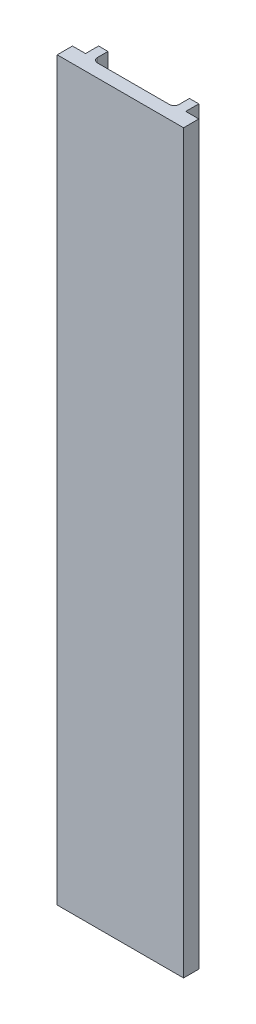
ISO-10303-21;
HEADER;
FILE_DESCRIPTION(('STEP AP214'),'2;1');
FILE_NAME('part.step','',(''),(''),'','','');
FILE_SCHEMA(('AUTOMOTIVE_DESIGN { 1 0 10303 214 1 1 1 1 }'));
ENDSEC;
DATA;
#1=APPLICATION_CONTEXT('core data for automotive mechanical design processes');
#2=APPLICATION_PROTOCOL_DEFINITION('international standard','automotive_design',2000,#1);
#3=PRODUCT_CONTEXT('',#1,'mechanical');
#4=PRODUCT('Part','Part','',(#3));
#5=PRODUCT_RELATED_PRODUCT_CATEGORY('part','',(#4));
#6=PRODUCT_DEFINITION_FORMATION('','',#4);
#7=PRODUCT_DEFINITION_CONTEXT('part definition',#1,'design');
#8=PRODUCT_DEFINITION('design','',#6,#7);
#9=PRODUCT_DEFINITION_SHAPE('','',#8);
#10=(LENGTH_UNIT() NAMED_UNIT(*) SI_UNIT(.MILLI.,.METRE.));
#11=(NAMED_UNIT(*) PLANE_ANGLE_UNIT() SI_UNIT($,.RADIAN.));
#12=(NAMED_UNIT(*) SI_UNIT($,.STERADIAN.) SOLID_ANGLE_UNIT());
#13=UNCERTAINTY_MEASURE_WITH_UNIT(LENGTH_MEASURE(1.E-05),#10,'distance_accuracy_value','');
#14=(GEOMETRIC_REPRESENTATION_CONTEXT(3) GLOBAL_UNCERTAINTY_ASSIGNED_CONTEXT((#13)) GLOBAL_UNIT_ASSIGNED_CONTEXT((#10,
#11,#12)) REPRESENTATION_CONTEXT('',''));
#15=CARTESIAN_POINT('',(0.,0.,0.));
#16=DIRECTION('',(0.,0.,1.));
#17=DIRECTION('',(1.,0.,0.));
#18=AXIS2_PLACEMENT_3D('',#15,#16,#17);
#19=CARTESIAN_POINT('',(0.,169.,0.));
#20=DIRECTION('',(1.,0.,0.));
#21=DIRECTION('',(0.,0.,-1.));
#22=AXIS2_PLACEMENT_3D('',#19,#20,#21);
#23=PLANE('',#22);
#24=DIRECTION('',(0.,-1.,0.));
#25=VECTOR('',#24,1.);
#26=CARTESIAN_POINT('',(0.,169.,-3.5));
#27=LINE('',#26,#25);
#28=CARTESIAN_POINT('',(0.,169.,-3.5));
#29=VERTEX_POINT('',#28);
#30=CARTESIAN_POINT('',(0.,0.,-3.5));
#31=VERTEX_POINT('',#30);
#32=EDGE_CURVE('E159',#29,#31,#27,.T.);
#33=ORIENTED_EDGE('',*,*,#32,.T.);
#34=DIRECTION('',(0.,0.,1.));
#35=VECTOR('',#34,1.);
#36=CARTESIAN_POINT('',(0.,0.,0.));
#37=LINE('',#36,#35);
#38=CARTESIAN_POINT('',(0.,0.,0.));
#39=VERTEX_POINT('',#38);
#40=EDGE_CURVE('E175',#31,#39,#37,.T.);
#41=ORIENTED_EDGE('',*,*,#40,.T.);
#42=DIRECTION('',(0.,-1.,0.));
#43=VECTOR('',#42,1.);
#44=CARTESIAN_POINT('',(0.,169.,0.));
#45=LINE('',#44,#43);
#46=CARTESIAN_POINT('',(0.,169.,0.));
#47=VERTEX_POINT('',#46);
#48=EDGE_CURVE('E11',#47,#39,#45,.T.);
#49=ORIENTED_EDGE('',*,*,#48,.F.);
#50=DIRECTION('',(0.,0.,1.));
#51=VECTOR('',#50,1.);
#52=CARTESIAN_POINT('',(0.,169.,0.));
#53=LINE('',#52,#51);
#54=EDGE_CURVE('E167',#29,#47,#53,.T.);
#55=ORIENTED_EDGE('',*,*,#54,.F.);
#56=EDGE_LOOP('',(#33,#41,#49,#55));
#57=FACE_BOUND('',#56,.T.);
#58=ADVANCED_FACE('F33',(#57),#23,.F.);
#59=CARTESIAN_POINT('',(29.,169.,0.));
#60=DIRECTION('',(-1.,0.,0.));
#61=DIRECTION('',(0.,0.,1.));
#62=AXIS2_PLACEMENT_3D('',#59,#60,#61);
#63=PLANE('',#62);
#64=DIRECTION('',(0.,-1.,0.));
#65=VECTOR('',#64,1.);
#66=CARTESIAN_POINT('',(29.,169.,-3.5));
#67=LINE('',#66,#65);
#68=CARTESIAN_POINT('',(29.,169.,-3.5));
#69=VERTEX_POINT('',#68);
#70=CARTESIAN_POINT('',(29.,0.,-3.5));
#71=VERTEX_POINT('',#70);
#72=EDGE_CURVE('E203',#69,#71,#67,.T.);
#73=ORIENTED_EDGE('',*,*,#72,.F.);
#74=DIRECTION('',(0.,0.,-1.));
#75=VECTOR('',#74,1.);
#76=CARTESIAN_POINT('',(29.,169.,0.));
#77=LINE('',#76,#75);
#78=CARTESIAN_POINT('',(29.,169.,0.));
#79=VERTEX_POINT('',#78);
#80=EDGE_CURVE('E194',#79,#69,#77,.T.);
#81=ORIENTED_EDGE('',*,*,#80,.F.);
#82=DIRECTION('',(0.,-1.,0.));
#83=VECTOR('',#82,1.);
#84=CARTESIAN_POINT('',(29.,169.,0.));
#85=LINE('',#84,#83);
#86=CARTESIAN_POINT('',(29.,0.,0.));
#87=VERTEX_POINT('',#86);
#88=EDGE_CURVE('E42',#79,#87,#85,.T.);
#89=ORIENTED_EDGE('',*,*,#88,.T.);
#90=DIRECTION('',(0.,0.,-1.));
#91=VECTOR('',#90,1.);
#92=CARTESIAN_POINT('',(29.,0.,0.));
#93=LINE('',#92,#91);
#94=EDGE_CURVE('E36',#87,#71,#93,.T.);
#95=ORIENTED_EDGE('',*,*,#94,.T.);
#96=EDGE_LOOP('',(#73,#81,#89,#95));
#97=FACE_BOUND('',#96,.T.);
#98=ADVANCED_FACE('F192',(#97),#63,.F.);
#99=CARTESIAN_POINT('',(0.,169.,-6.5));
#100=DIRECTION('',(0.,0.,1.));
#101=DIRECTION('',(1.,0.,0.));
#102=AXIS2_PLACEMENT_3D('',#99,#100,#101);
#103=PLANE('',#102);
#104=DIRECTION('',(0.,-1.,0.));
#105=VECTOR('',#104,1.);
#106=CARTESIAN_POINT('',(5.15,170.,-6.5));
#107=LINE('',#106,#105);
#108=CARTESIAN_POINT('',(5.15,169.,-6.5));
#109=VERTEX_POINT('',#108);
#110=CARTESIAN_POINT('',(5.15,0.,-6.5));
#111=VERTEX_POINT('',#110);
#112=EDGE_CURVE('E163',#109,#111,#107,.T.);
#113=ORIENTED_EDGE('',*,*,#112,.T.);
#114=DIRECTION('',(-1.,0.,0.));
#115=VECTOR('',#114,1.);
#116=CARTESIAN_POINT('',(0.,0.,-6.5));
#117=LINE('',#116,#115);
#118=CARTESIAN_POINT('',(3.,0.,-6.5));
#119=VERTEX_POINT('',#118);
#120=EDGE_CURVE('E155',#111,#119,#117,.T.);
#121=ORIENTED_EDGE('',*,*,#120,.T.);
#122=DIRECTION('',(0.,-1.,0.));
#123=VECTOR('',#122,1.);
#124=CARTESIAN_POINT('',(3.,169.,-6.5));
#125=LINE('',#124,#123);
#126=CARTESIAN_POINT('',(3.,169.,-6.5));
#127=VERTEX_POINT('',#126);
#128=EDGE_CURVE('E137',#127,#119,#125,.T.);
#129=ORIENTED_EDGE('',*,*,#128,.F.);
#130=DIRECTION('',(-1.,0.,0.));
#131=VECTOR('',#130,1.);
#132=CARTESIAN_POINT('',(0.,169.,-6.5));
#133=LINE('',#132,#131);
#134=EDGE_CURVE('E180',#109,#127,#133,.T.);
#135=ORIENTED_EDGE('',*,*,#134,.F.);
#136=EDGE_LOOP('',(#113,#121,#129,#135));
#137=FACE_BOUND('',#136,.T.);
#138=ADVANCED_FACE('F162',(#137),#103,.F.);
#139=DIRECTION('',(0.,-1.,0.));
#140=VECTOR('',#139,1.);
#141=CARTESIAN_POINT('',(23.85,170.,-6.5));
#142=LINE('',#141,#140);
#143=CARTESIAN_POINT('',(23.85,169.,-6.5));
#144=VERTEX_POINT('',#143);
#145=CARTESIAN_POINT('',(23.85,0.,-6.5));
#146=VERTEX_POINT('',#145);
#147=EDGE_CURVE('E149',#144,#146,#142,.T.);
#148=ORIENTED_EDGE('',*,*,#147,.F.);
#149=CARTESIAN_POINT('',(26.,169.,-6.5));
#150=VERTEX_POINT('',#149);
#151=EDGE_CURVE('E174',#150,#144,#133,.T.);
#152=ORIENTED_EDGE('',*,*,#151,.F.);
#153=DIRECTION('',(0.,-1.,0.));
#154=VECTOR('',#153,1.);
#155=CARTESIAN_POINT('',(26.,169.,-6.5));
#156=LINE('',#155,#154);
#157=CARTESIAN_POINT('',(26.,0.,-6.5));
#158=VERTEX_POINT('',#157);
#159=EDGE_CURVE('E201',#150,#158,#156,.T.);
#160=ORIENTED_EDGE('',*,*,#159,.T.);
#161=EDGE_CURVE('E164',#158,#146,#117,.T.);
#162=ORIENTED_EDGE('',*,*,#161,.T.);
#163=EDGE_LOOP('',(#148,#152,#160,#162));
#164=FACE_BOUND('',#163,.T.);
#165=ADVANCED_FACE('F270',(#164),#103,.F.);
#166=CARTESIAN_POINT('',(0.,169.,0.));
#167=DIRECTION('',(0.,-1.,0.));
#168=DIRECTION('',(0.,0.,-1.));
#169=AXIS2_PLACEMENT_3D('',#166,#167,#168);
#170=PLANE('',#169);
#171=DIRECTION('',(0.,0.,1.));
#172=VECTOR('',#171,1.);
#173=CARTESIAN_POINT('',(5.15,169.,0.));
#174=LINE('',#173,#172);
#175=CARTESIAN_POINT('',(5.15,169.,-4.1));
#176=VERTEX_POINT('',#175);
#177=EDGE_CURVE('E177',#109,#176,#174,.T.);
#178=ORIENTED_EDGE('',*,*,#177,.F.);
#179=ORIENTED_EDGE('',*,*,#134,.T.);
#180=DIRECTION('',(0.,0.,-1.));
#181=VECTOR('',#180,1.);
#182=CARTESIAN_POINT('',(3.,169.,-6.5));
#183=LINE('',#182,#181);
#184=CARTESIAN_POINT('',(3.,169.,-3.5));
#185=VERTEX_POINT('',#184);
#186=EDGE_CURVE('E144',#185,#127,#183,.T.);
#187=ORIENTED_EDGE('',*,*,#186,.F.);
#188=DIRECTION('',(1.,0.,0.));
#189=VECTOR('',#188,1.);
#190=CARTESIAN_POINT('',(0.,169.,-3.5));
#191=LINE('',#190,#189);
#192=EDGE_CURVE('E218',#29,#185,#191,.T.);
#193=ORIENTED_EDGE('',*,*,#192,.F.);
#194=ORIENTED_EDGE('',*,*,#54,.T.);
#195=DIRECTION('',(1.,0.,0.));
#196=VECTOR('',#195,1.);
#197=CARTESIAN_POINT('',(0.,169.,0.));
#198=LINE('',#197,#196);
#199=EDGE_CURVE('E259',#47,#79,#198,.T.);
#200=ORIENTED_EDGE('',*,*,#199,.T.);
#201=ORIENTED_EDGE('',*,*,#80,.T.);
#202=DIRECTION('',(1.,0.,0.));
#203=VECTOR('',#202,1.);
#204=CARTESIAN_POINT('',(29.,169.,-3.5));
#205=LINE('',#204,#203);
#206=CARTESIAN_POINT('',(26.,169.,-3.5));
#207=VERTEX_POINT('',#206);
#208=EDGE_CURVE('E216',#207,#69,#205,.T.);
#209=ORIENTED_EDGE('',*,*,#208,.F.);
#210=DIRECTION('',(0.,0.,1.));
#211=VECTOR('',#210,1.);
#212=CARTESIAN_POINT('',(26.,169.,-6.5));
#213=LINE('',#212,#211);
#214=EDGE_CURVE('E219',#150,#207,#213,.T.);
#215=ORIENTED_EDGE('',*,*,#214,.F.);
#216=ORIENTED_EDGE('',*,*,#151,.T.);
#217=DIRECTION('',(0.,0.,-1.));
#218=VECTOR('',#217,1.);
#219=CARTESIAN_POINT('',(23.85,169.,0.));
#220=LINE('',#219,#218);
#221=CARTESIAN_POINT('',(23.85,169.,-4.1));
#222=VERTEX_POINT('',#221);
#223=EDGE_CURVE('E253',#222,#144,#220,.T.);
#224=ORIENTED_EDGE('',*,*,#223,.F.);
#225=CARTESIAN_POINT('',(22.75,169.,-4.1));
#226=DIRECTION('',(0.,-1.,0.));
#227=DIRECTION('',(0.,0.,-1.));
#228=AXIS2_PLACEMENT_3D('',#225,#226,#227);
#229=CIRCLE('',#228,1.1);
#230=CARTESIAN_POINT('',(22.75,169.,-3.));
#231=VERTEX_POINT('',#230);
#232=EDGE_CURVE('E247',#222,#231,#229,.T.);
#233=ORIENTED_EDGE('',*,*,#232,.T.);
#234=DIRECTION('',(1.,0.,0.));
#235=VECTOR('',#234,1.);
#236=CARTESIAN_POINT('',(0.,169.,-3.));
#237=LINE('',#236,#235);
#238=CARTESIAN_POINT('',(6.25,169.,-3.));
#239=VERTEX_POINT('',#238);
#240=EDGE_CURVE('E255',#239,#231,#237,.T.);
#241=ORIENTED_EDGE('',*,*,#240,.F.);
#242=CARTESIAN_POINT('',(6.25,169.,-4.1));
#243=DIRECTION('',(0.,-1.,0.));
#244=DIRECTION('',(0.,0.,-1.));
#245=AXIS2_PLACEMENT_3D('',#242,#243,#244);
#246=CIRCLE('',#245,1.1);
#247=EDGE_CURVE('E250',#239,#176,#246,.T.);
#248=ORIENTED_EDGE('',*,*,#247,.T.);
#249=EDGE_LOOP('',(#178,#179,#187,#193,#194,#200,#201,#209,#215,#216,#224,#233,#241,#248));
#250=FACE_BOUND('',#249,.T.);
#251=ADVANCED_FACE('F267',(#250),#170,.F.);
#252=CARTESIAN_POINT('',(0.,0.,0.));
#253=DIRECTION('',(0.,-1.,0.));
#254=DIRECTION('',(0.,0.,-1.));
#255=AXIS2_PLACEMENT_3D('',#252,#253,#254);
#256=PLANE('',#255);
#257=ORIENTED_EDGE('',*,*,#120,.F.);
#258=DIRECTION('',(0.,0.,1.));
#259=VECTOR('',#258,1.);
#260=CARTESIAN_POINT('',(5.15,0.,-6.5));
#261=LINE('',#260,#259);
#262=CARTESIAN_POINT('',(5.15,0.,-4.1));
#263=VERTEX_POINT('',#262);
#264=EDGE_CURVE('E224',#111,#263,#261,.T.);
#265=ORIENTED_EDGE('',*,*,#264,.T.);
#266=CARTESIAN_POINT('',(6.25,0.,-4.1));
#267=DIRECTION('',(0.,1.,0.));
#268=DIRECTION('',(0.,0.,1.));
#269=AXIS2_PLACEMENT_3D('',#266,#267,#268);
#270=CIRCLE('',#269,1.1);
#271=CARTESIAN_POINT('',(6.25,0.,-3.));
#272=VERTEX_POINT('',#271);
#273=EDGE_CURVE('E239',#272,#263,#270,.F.);
#274=ORIENTED_EDGE('',*,*,#273,.F.);
#275=DIRECTION('',(1.,0.,0.));
#276=VECTOR('',#275,1.);
#277=CARTESIAN_POINT('',(5.15,0.,-3.));
#278=LINE('',#277,#276);
#279=CARTESIAN_POINT('',(22.75,0.,-3.));
#280=VERTEX_POINT('',#279);
#281=EDGE_CURVE('E227',#272,#280,#278,.T.);
#282=ORIENTED_EDGE('',*,*,#281,.T.);
#283=CARTESIAN_POINT('',(22.75,0.,-4.1));
#284=DIRECTION('',(0.,1.,0.));
#285=DIRECTION('',(0.,0.,1.));
#286=AXIS2_PLACEMENT_3D('',#283,#284,#285);
#287=CIRCLE('',#286,1.1);
#288=CARTESIAN_POINT('',(23.85,0.,-4.1));
#289=VERTEX_POINT('',#288);
#290=EDGE_CURVE('E236',#289,#280,#287,.F.);
#291=ORIENTED_EDGE('',*,*,#290,.F.);
#292=DIRECTION('',(0.,0.,-1.));
#293=VECTOR('',#292,1.);
#294=CARTESIAN_POINT('',(23.85,0.,-3.));
#295=LINE('',#294,#293);
#296=EDGE_CURVE('E50',#289,#146,#295,.T.);
#297=ORIENTED_EDGE('',*,*,#296,.T.);
#298=ORIENTED_EDGE('',*,*,#161,.F.);
#299=DIRECTION('',(0.,0.,1.));
#300=VECTOR('',#299,1.);
#301=CARTESIAN_POINT('',(26.,0.,-6.5));
#302=LINE('',#301,#300);
#303=CARTESIAN_POINT('',(26.,0.,-3.5));
#304=VERTEX_POINT('',#303);
#305=EDGE_CURVE('E199',#158,#304,#302,.T.);
#306=ORIENTED_EDGE('',*,*,#305,.T.);
#307=DIRECTION('',(1.,0.,0.));
#308=VECTOR('',#307,1.);
#309=CARTESIAN_POINT('',(29.,0.,-3.5));
#310=LINE('',#309,#308);
#311=EDGE_CURVE('E197',#304,#71,#310,.T.);
#312=ORIENTED_EDGE('',*,*,#311,.T.);
#313=ORIENTED_EDGE('',*,*,#94,.F.);
#314=DIRECTION('',(1.,0.,0.));
#315=VECTOR('',#314,1.);
#316=CARTESIAN_POINT('',(0.,0.,0.));
#317=LINE('',#316,#315);
#318=EDGE_CURVE('E169',#39,#87,#317,.T.);
#319=ORIENTED_EDGE('',*,*,#318,.F.);
#320=ORIENTED_EDGE('',*,*,#40,.F.);
#321=DIRECTION('',(1.,0.,0.));
#322=VECTOR('',#321,1.);
#323=CARTESIAN_POINT('',(0.,0.,-3.5));
#324=LINE('',#323,#322);
#325=CARTESIAN_POINT('',(3.,0.,-3.5));
#326=VERTEX_POINT('',#325);
#327=EDGE_CURVE('E157',#31,#326,#324,.T.);
#328=ORIENTED_EDGE('',*,*,#327,.T.);
#329=DIRECTION('',(0.,0.,-1.));
#330=VECTOR('',#329,1.);
#331=CARTESIAN_POINT('',(3.,0.,-6.5));
#332=LINE('',#331,#330);
#333=EDGE_CURVE('E141',#326,#119,#332,.T.);
#334=ORIENTED_EDGE('',*,*,#333,.T.);
#335=EDGE_LOOP('',(#257,#265,#274,#282,#291,#297,#298,#306,#312,#313,#319,#320,#328,#334));
#336=FACE_BOUND('',#335,.T.);
#337=ADVANCED_FACE('F153',(#336),#256,.T.);
#338=CARTESIAN_POINT('',(0.,169.,0.));
#339=DIRECTION('',(0.,0.,-1.));
#340=DIRECTION('',(-1.,0.,0.));
#341=AXIS2_PLACEMENT_3D('',#338,#339,#340);
#342=PLANE('',#341);
#343=ORIENTED_EDGE('',*,*,#318,.T.);
#344=ORIENTED_EDGE('',*,*,#88,.F.);
#345=ORIENTED_EDGE('',*,*,#199,.F.);
#346=ORIENTED_EDGE('',*,*,#48,.T.);
#347=EDGE_LOOP('',(#343,#344,#345,#346));
#348=FACE_BOUND('',#347,.T.);
#349=ADVANCED_FACE('F185',(#348),#342,.F.);
#350=CARTESIAN_POINT('',(0.,169.,-3.5));
#351=DIRECTION('',(0.,0.,-1.));
#352=DIRECTION('',(-1.,0.,0.));
#353=AXIS2_PLACEMENT_3D('',#350,#351,#352);
#354=PLANE('',#353);
#355=ORIENTED_EDGE('',*,*,#327,.F.);
#356=ORIENTED_EDGE('',*,*,#32,.F.);
#357=ORIENTED_EDGE('',*,*,#192,.T.);
#358=DIRECTION('',(0.,-1.,0.));
#359=VECTOR('',#358,1.);
#360=CARTESIAN_POINT('',(3.,169.,-3.5));
#361=LINE('',#360,#359);
#362=EDGE_CURVE('E158',#185,#326,#361,.T.);
#363=ORIENTED_EDGE('',*,*,#362,.T.);
#364=EDGE_LOOP('',(#355,#356,#357,#363));
#365=FACE_BOUND('',#364,.T.);
#366=ADVANCED_FACE('F310',(#365),#354,.T.);
#367=CARTESIAN_POINT('',(3.,169.,-6.5));
#368=DIRECTION('',(-1.,0.,0.));
#369=DIRECTION('',(0.,0.,1.));
#370=AXIS2_PLACEMENT_3D('',#367,#368,#369);
#371=PLANE('',#370);
#372=ORIENTED_EDGE('',*,*,#333,.F.);
#373=ORIENTED_EDGE('',*,*,#362,.F.);
#374=ORIENTED_EDGE('',*,*,#186,.T.);
#375=ORIENTED_EDGE('',*,*,#128,.T.);
#376=EDGE_LOOP('',(#372,#373,#374,#375));
#377=FACE_BOUND('',#376,.T.);
#378=ADVANCED_FACE('F139',(#377),#371,.T.);
#379=CARTESIAN_POINT('',(26.,169.,-6.5));
#380=DIRECTION('',(1.,0.,0.));
#381=DIRECTION('',(0.,0.,-1.));
#382=AXIS2_PLACEMENT_3D('',#379,#380,#381);
#383=PLANE('',#382);
#384=ORIENTED_EDGE('',*,*,#305,.F.);
#385=ORIENTED_EDGE('',*,*,#159,.F.);
#386=ORIENTED_EDGE('',*,*,#214,.T.);
#387=DIRECTION('',(0.,-1.,0.));
#388=VECTOR('',#387,1.);
#389=CARTESIAN_POINT('',(26.,169.,-3.5));
#390=LINE('',#389,#388);
#391=EDGE_CURVE('E58',#207,#304,#390,.T.);
#392=ORIENTED_EDGE('',*,*,#391,.T.);
#393=EDGE_LOOP('',(#384,#385,#386,#392));
#394=FACE_BOUND('',#393,.T.);
#395=ADVANCED_FACE('F293',(#394),#383,.T.);
#396=CARTESIAN_POINT('',(29.,169.,-3.5));
#397=DIRECTION('',(0.,0.,-1.));
#398=DIRECTION('',(-1.,0.,0.));
#399=AXIS2_PLACEMENT_3D('',#396,#397,#398);
#400=PLANE('',#399);
#401=ORIENTED_EDGE('',*,*,#311,.F.);
#402=ORIENTED_EDGE('',*,*,#391,.F.);
#403=ORIENTED_EDGE('',*,*,#208,.T.);
#404=ORIENTED_EDGE('',*,*,#72,.T.);
#405=EDGE_LOOP('',(#401,#402,#403,#404));
#406=FACE_BOUND('',#405,.T.);
#407=ADVANCED_FACE('F286',(#406),#400,.T.);
#408=CARTESIAN_POINT('',(5.15,170.,-6.5));
#409=DIRECTION('',(1.,0.,0.));
#410=DIRECTION('',(0.,0.,-1.));
#411=AXIS2_PLACEMENT_3D('',#408,#409,#410);
#412=PLANE('',#411);
#413=ORIENTED_EDGE('',*,*,#177,.T.);
#414=DIRECTION('',(0.,-1.,0.));
#415=VECTOR('',#414,1.);
#416=CARTESIAN_POINT('',(5.15,170.,-4.1));
#417=LINE('',#416,#415);
#418=EDGE_CURVE('E242',#263,#176,#417,.F.);
#419=ORIENTED_EDGE('',*,*,#418,.F.);
#420=ORIENTED_EDGE('',*,*,#264,.F.);
#421=ORIENTED_EDGE('',*,*,#112,.F.);
#422=EDGE_LOOP('',(#413,#419,#420,#421));
#423=FACE_BOUND('',#422,.T.);
#424=ADVANCED_FACE('F284',(#423),#412,.T.);
#425=CARTESIAN_POINT('',(5.15,170.,-3.));
#426=DIRECTION('',(0.,0.,-1.));
#427=DIRECTION('',(-1.,0.,0.));
#428=AXIS2_PLACEMENT_3D('',#425,#426,#427);
#429=PLANE('',#428);
#430=ORIENTED_EDGE('',*,*,#240,.T.);
#431=DIRECTION('',(0.,-1.,0.));
#432=VECTOR('',#431,1.);
#433=CARTESIAN_POINT('',(22.75,170.,-3.));
#434=LINE('',#433,#432);
#435=EDGE_CURVE('E231',#280,#231,#434,.F.);
#436=ORIENTED_EDGE('',*,*,#435,.F.);
#437=ORIENTED_EDGE('',*,*,#281,.F.);
#438=DIRECTION('',(0.,-1.,0.));
#439=VECTOR('',#438,1.);
#440=CARTESIAN_POINT('',(6.25,170.,-3.));
#441=LINE('',#440,#439);
#442=EDGE_CURVE('E234',#239,#272,#441,.T.);
#443=ORIENTED_EDGE('',*,*,#442,.F.);
#444=EDGE_LOOP('',(#430,#436,#437,#443));
#445=FACE_BOUND('',#444,.T.);
#446=ADVANCED_FACE('F280',(#445),#429,.T.);
#447=CARTESIAN_POINT('',(23.85,170.,-3.));
#448=DIRECTION('',(-1.,0.,0.));
#449=DIRECTION('',(0.,0.,1.));
#450=AXIS2_PLACEMENT_3D('',#447,#448,#449);
#451=PLANE('',#450);
#452=ORIENTED_EDGE('',*,*,#223,.T.);
#453=ORIENTED_EDGE('',*,*,#147,.T.);
#454=ORIENTED_EDGE('',*,*,#296,.F.);
#455=DIRECTION('',(0.,-1.,0.));
#456=VECTOR('',#455,1.);
#457=CARTESIAN_POINT('',(23.85,170.,-4.1));
#458=LINE('',#457,#456);
#459=EDGE_CURVE('E245',#222,#289,#458,.T.);
#460=ORIENTED_EDGE('',*,*,#459,.F.);
#461=EDGE_LOOP('',(#452,#453,#454,#460));
#462=FACE_BOUND('',#461,.T.);
#463=ADVANCED_FACE('F271',(#462),#451,.T.);
#464=CARTESIAN_POINT('',(6.25,170.,-4.1));
#465=DIRECTION('',(0.,-1.,0.));
#466=DIRECTION('',(0.,0.,-1.));
#467=AXIS2_PLACEMENT_3D('',#464,#465,#466);
#468=CYLINDRICAL_SURFACE('',#467,1.1);
#469=ORIENTED_EDGE('',*,*,#442,.T.);
#470=ORIENTED_EDGE('',*,*,#273,.T.);
#471=ORIENTED_EDGE('',*,*,#418,.T.);
#472=ORIENTED_EDGE('',*,*,#247,.F.);
#473=EDGE_LOOP('',(#469,#470,#471,#472));
#474=FACE_BOUND('',#473,.T.);
#475=ADVANCED_FACE('F282',(#474),#468,.F.);
#476=CARTESIAN_POINT('',(22.75,170.,-4.1));
#477=DIRECTION('',(0.,-1.,0.));
#478=DIRECTION('',(0.,0.,-1.));
#479=AXIS2_PLACEMENT_3D('',#476,#477,#478);
#480=CYLINDRICAL_SURFACE('',#479,1.1);
#481=ORIENTED_EDGE('',*,*,#459,.T.);
#482=ORIENTED_EDGE('',*,*,#290,.T.);
#483=ORIENTED_EDGE('',*,*,#435,.T.);
#484=ORIENTED_EDGE('',*,*,#232,.F.);
#485=EDGE_LOOP('',(#481,#482,#483,#484));
#486=FACE_BOUND('',#485,.T.);
#487=ADVANCED_FACE('F276',(#486),#480,.F.);
#488=CLOSED_SHELL('',(#58,#98,#138,#165,#251,#337,#349,#366,#378,#395,#407,#424,#446,#463,#475,#487));
#489=MANIFOLD_SOLID_BREP('B2',#488);
#490=ADVANCED_BREP_SHAPE_REPRESENTATION('',(#18,#489),#14);
#491=SHAPE_DEFINITION_REPRESENTATION(#9,#490);
ENDSEC;
END-ISO-10303-21;
